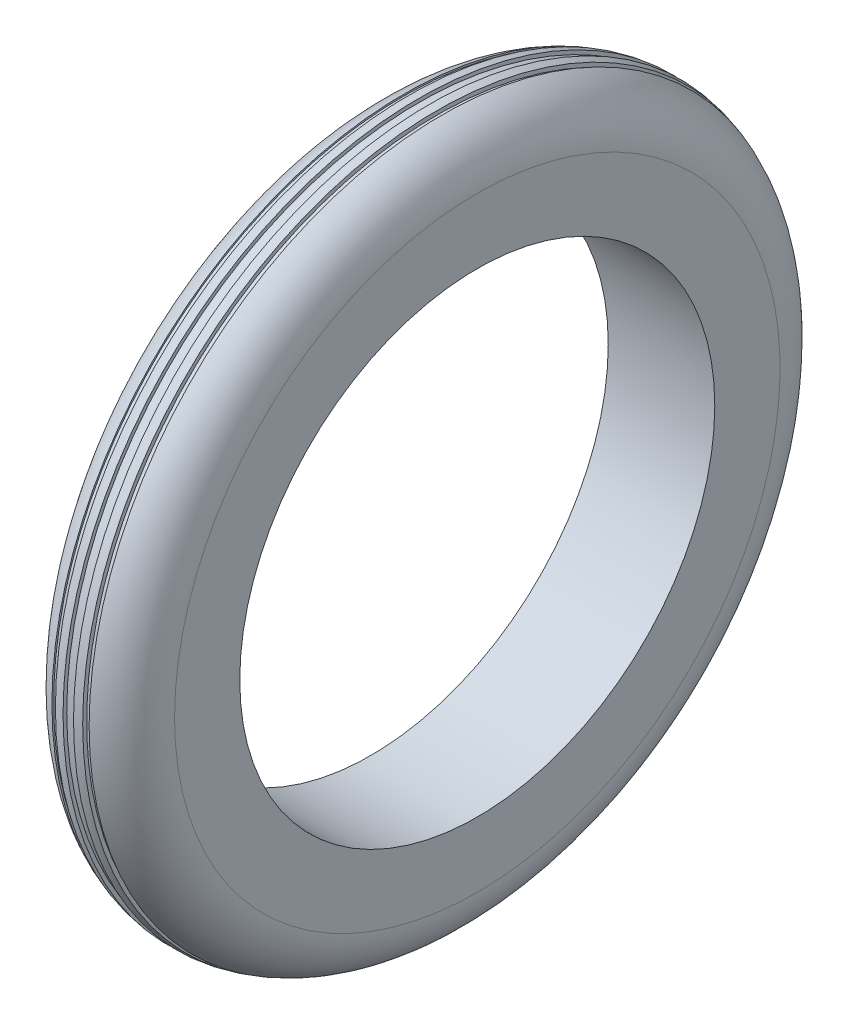
ISO-10303-21;
HEADER;
FILE_DESCRIPTION(('STEP AP214'),'2;1');
FILE_NAME('part.step','',(''),(''),'','','');
FILE_SCHEMA(('AUTOMOTIVE_DESIGN { 1 0 10303 214 1 1 1 1 }'));
ENDSEC;
DATA;
#1=APPLICATION_CONTEXT('core data for automotive mechanical design processes');
#2=APPLICATION_PROTOCOL_DEFINITION('international standard','automotive_design',2000,#1);
#3=PRODUCT_CONTEXT('',#1,'mechanical');
#4=PRODUCT('Part','Part','',(#3));
#5=PRODUCT_RELATED_PRODUCT_CATEGORY('part','',(#4));
#6=PRODUCT_DEFINITION_FORMATION('','',#4);
#7=PRODUCT_DEFINITION_CONTEXT('part definition',#1,'design');
#8=PRODUCT_DEFINITION('design','',#6,#7);
#9=PRODUCT_DEFINITION_SHAPE('','',#8);
#10=(LENGTH_UNIT() NAMED_UNIT(*) SI_UNIT(.MILLI.,.METRE.));
#11=(NAMED_UNIT(*) PLANE_ANGLE_UNIT() SI_UNIT($,.RADIAN.));
#12=(NAMED_UNIT(*) SI_UNIT($,.STERADIAN.) SOLID_ANGLE_UNIT());
#13=UNCERTAINTY_MEASURE_WITH_UNIT(LENGTH_MEASURE(1.E-05),#10,'distance_accuracy_value','');
#14=(GEOMETRIC_REPRESENTATION_CONTEXT(3) GLOBAL_UNCERTAINTY_ASSIGNED_CONTEXT((#13)) GLOBAL_UNIT_ASSIGNED_CONTEXT((#10,
#11,#12)) REPRESENTATION_CONTEXT('',''));
#15=CARTESIAN_POINT('',(0.,0.,0.));
#16=DIRECTION('',(0.,0.,1.));
#17=DIRECTION('',(1.,0.,0.));
#18=AXIS2_PLACEMENT_3D('',#15,#16,#17);
#19=CARTESIAN_POINT('',(0.,0.,0.));
#20=DIRECTION('',(-1.,0.,0.));
#21=DIRECTION('',(0.,0.,1.));
#22=AXIS2_PLACEMENT_3D('',#19,#20,#21);
#23=TOROIDAL_SURFACE('',#22,57.3569794050343,10.091533180778);
#24=CARTESIAN_POINT('',(3.40400652026257,0.,0.));
#25=DIRECTION('',(1.,0.,0.));
#26=DIRECTION('',(0.,0.,-1.));
#27=AXIS2_PLACEMENT_3D('',#24,#25,#26);
#28=CIRCLE('',#27,66.8570731702955);
#29=CARTESIAN_POINT('',(3.40400652026257,0.,-66.8570731702955));
#30=VERTEX_POINT('',#29);
#31=EDGE_CURVE('E62',#30,#30,#28,.T.);
#32=ORIENTED_EDGE('',*,*,#31,.T.);
#33=EDGE_LOOP('',(#32));
#34=FACE_BOUND('',#33,.T.);
#35=CARTESIAN_POINT('',(10.091533180778,0.,0.));
#36=DIRECTION('',(-1.,0.,0.));
#37=DIRECTION('',(0.,0.,1.));
#38=AXIS2_PLACEMENT_3D('',#35,#36,#37);
#39=CIRCLE('',#38,57.3569794050343);
#40=CARTESIAN_POINT('',(10.091533180778,0.,57.3569794050343));
#41=VERTEX_POINT('',#40);
#42=EDGE_CURVE('E69',#41,#41,#39,.T.);
#43=ORIENTED_EDGE('',*,*,#42,.T.);
#44=EDGE_LOOP('',(#43));
#45=FACE_BOUND('',#44,.T.);
#46=ADVANCED_FACE('F35',(#34,#45),#23,.T.);
#47=CARTESIAN_POINT('',(-3.79205614659731,0.,0.));
#48=DIRECTION('',(-1.,0.,0.));
#49=DIRECTION('',(0.,0.,1.));
#50=AXIS2_PLACEMENT_3D('',#47,#48,#49);
#51=CIRCLE('',#50,66.7089498989889);
#52=CARTESIAN_POINT('',(-3.79205614659731,0.,66.7089498989889));
#53=VERTEX_POINT('',#52);
#54=EDGE_CURVE('E64',#53,#53,#51,.T.);
#55=ORIENTED_EDGE('',*,*,#54,.T.);
#56=EDGE_LOOP('',(#55));
#57=FACE_BOUND('',#56,.T.);
#58=CARTESIAN_POINT('',(-10.091533180778,0.,0.));
#59=DIRECTION('',(-1.,0.,0.));
#60=DIRECTION('',(0.,0.,1.));
#61=AXIS2_PLACEMENT_3D('',#58,#59,#60);
#62=CIRCLE('',#61,57.3569794050343);
#63=CARTESIAN_POINT('',(-10.091533180778,0.,57.3569794050343));
#64=VERTEX_POINT('',#63);
#65=EDGE_CURVE('E48',#64,#64,#62,.T.);
#66=ORIENTED_EDGE('',*,*,#65,.F.);
#67=EDGE_LOOP('',(#66));
#68=FACE_BOUND('',#67,.T.);
#69=ADVANCED_FACE('F119',(#57,#68),#23,.T.);
#70=CARTESIAN_POINT('',(10.091533180778,57.3569794050343,0.));
#71=DIRECTION('',(-1.,0.,0.));
#72=DIRECTION('',(0.,0.,1.));
#73=AXIS2_PLACEMENT_3D('',#70,#71,#72);
#74=PLANE('',#73);
#75=ORIENTED_EDGE('',*,*,#42,.F.);
#76=EDGE_LOOP('',(#75));
#77=FACE_BOUND('',#76,.T.);
#78=CARTESIAN_POINT('',(10.091533180778,0.,0.));
#79=DIRECTION('',(-1.,0.,0.));
#80=DIRECTION('',(0.,0.,1.));
#81=AXIS2_PLACEMENT_3D('',#78,#79,#80);
#82=CIRCLE('',#81,45.);
#83=CARTESIAN_POINT('',(10.091533180778,0.,45.));
#84=VERTEX_POINT('',#83);
#85=EDGE_CURVE('E10',#84,#84,#82,.T.);
#86=ORIENTED_EDGE('',*,*,#85,.T.);
#87=EDGE_LOOP('',(#86));
#88=FACE_BOUND('',#87,.T.);
#89=ADVANCED_FACE('F37',(#77,#88),#74,.F.);
#90=CARTESIAN_POINT('',(-52.28566048094,0.,0.));
#91=DIRECTION('',(-1.,0.,0.));
#92=DIRECTION('',(0.,0.,1.));
#93=AXIS2_PLACEMENT_3D('',#90,#91,#92);
#94=CYLINDRICAL_SURFACE('',#93,45.);
#95=ORIENTED_EDGE('',*,*,#85,.F.);
#96=EDGE_LOOP('',(#95));
#97=FACE_BOUND('',#96,.T.);
#98=CARTESIAN_POINT('',(-10.091533180778,0.,0.));
#99=DIRECTION('',(-1.,0.,0.));
#100=DIRECTION('',(0.,0.,1.));
#101=AXIS2_PLACEMENT_3D('',#98,#99,#100);
#102=CIRCLE('',#101,45.);
#103=CARTESIAN_POINT('',(-10.091533180778,0.,45.));
#104=VERTEX_POINT('',#103);
#105=EDGE_CURVE('E43',#104,#104,#102,.T.);
#106=ORIENTED_EDGE('',*,*,#105,.T.);
#107=EDGE_LOOP('',(#106));
#108=FACE_BOUND('',#107,.T.);
#109=ADVANCED_FACE('F230',(#97,#108),#94,.F.);
#110=CARTESIAN_POINT('',(-10.091533180778,57.3569794050343,0.));
#111=DIRECTION('',(1.,0.,0.));
#112=DIRECTION('',(0.,0.,-1.));
#113=AXIS2_PLACEMENT_3D('',#110,#111,#112);
#114=PLANE('',#113);
#115=ORIENTED_EDGE('',*,*,#105,.F.);
#116=EDGE_LOOP('',(#115));
#117=FACE_BOUND('',#116,.T.);
#118=ORIENTED_EDGE('',*,*,#65,.T.);
#119=EDGE_LOOP('',(#118));
#120=FACE_BOUND('',#119,.T.);
#121=ADVANCED_FACE('F173',(#117,#120),#114,.F.);
#122=CARTESIAN_POINT('',(3.40400652026257,71.0572143164591,0.));
#123=DIRECTION('',(1.,0.,0.));
#124=DIRECTION('',(0.,0.,-1.));
#125=AXIS2_PLACEMENT_3D('',#122,#123,#124);
#126=PLANE('',#125);
#127=CARTESIAN_POINT('',(3.40400652026257,0.,0.));
#128=DIRECTION('',(1.,0.,0.));
#129=DIRECTION('',(0.,0.,-1.));
#130=AXIS2_PLACEMENT_3D('',#127,#128,#129);
#131=CIRCLE('',#130,66.3894979920094);
#132=CARTESIAN_POINT('',(3.40400652026257,0.,-66.3894979920094));
#133=VERTEX_POINT('',#132);
#134=EDGE_CURVE('E87',#133,#133,#131,.T.);
#135=ORIENTED_EDGE('',*,*,#134,.T.);
#136=EDGE_LOOP('',(#135));
#137=FACE_BOUND('',#136,.T.);
#138=ORIENTED_EDGE('',*,*,#31,.F.);
#139=EDGE_LOOP('',(#138));
#140=FACE_BOUND('',#139,.T.);
#141=ADVANCED_FACE('F96',(#137,#140),#126,.F.);
#142=CARTESIAN_POINT('',(2.47046325537265,71.0572143164591,0.));
#143=DIRECTION('',(-1.,0.,0.));
#144=DIRECTION('',(0.,0.,1.));
#145=AXIS2_PLACEMENT_3D('',#142,#143,#144);
#146=PLANE('',#145);
#147=CARTESIAN_POINT('',(2.47046325537265,0.,0.));
#148=DIRECTION('',(1.,0.,0.));
#149=DIRECTION('',(0.,0.,-1.));
#150=AXIS2_PLACEMENT_3D('',#147,#148,#149);
#151=CIRCLE('',#150,66.3894979920094);
#152=CARTESIAN_POINT('',(2.47046325537265,0.,-66.3894979920094));
#153=VERTEX_POINT('',#152);
#154=EDGE_CURVE('E83',#153,#153,#151,.T.);
#155=ORIENTED_EDGE('',*,*,#154,.F.);
#156=EDGE_LOOP('',(#155));
#157=FACE_BOUND('',#156,.T.);
#158=CARTESIAN_POINT('',(2.47046325537265,0.,0.));
#159=DIRECTION('',(-1.,0.,0.));
#160=DIRECTION('',(0.,0.,1.));
#161=AXIS2_PLACEMENT_3D('',#158,#159,#160);
#162=CIRCLE('',#161,67.1414494081871);
#163=CARTESIAN_POINT('',(2.47046325537265,0.,67.1414494081871));
#164=VERTEX_POINT('',#163);
#165=EDGE_CURVE('E59',#164,#164,#162,.T.);
#166=ORIENTED_EDGE('',*,*,#165,.F.);
#167=EDGE_LOOP('',(#166));
#168=FACE_BOUND('',#167,.T.);
#169=ADVANCED_FACE('F103',(#157,#168),#146,.F.);
#170=CARTESIAN_POINT('',(38.3675753563151,0.,0.));
#171=DIRECTION('',(1.,0.,0.));
#172=DIRECTION('',(0.,0.,-1.));
#173=AXIS2_PLACEMENT_3D('',#170,#171,#172);
#174=CYLINDRICAL_SURFACE('',#173,66.3894979920094);
#175=ORIENTED_EDGE('',*,*,#134,.F.);
#176=EDGE_LOOP('',(#175));
#177=FACE_BOUND('',#176,.T.);
#178=ORIENTED_EDGE('',*,*,#154,.T.);
#179=EDGE_LOOP('',(#178));
#180=FACE_BOUND('',#179,.T.);
#181=ADVANCED_FACE('F99',(#177,#180),#174,.T.);
#182=CARTESIAN_POINT('',(-2.78071760963323,71.0572143164591,0.));
#183=DIRECTION('',(1.,0.,0.));
#184=DIRECTION('',(0.,0.,-1.));
#185=AXIS2_PLACEMENT_3D('',#182,#183,#184);
#186=PLANE('',#185);
#187=CARTESIAN_POINT('',(-2.78071760963323,0.,0.));
#188=DIRECTION('',(1.,0.,0.));
#189=DIRECTION('',(0.,0.,-1.));
#190=AXIS2_PLACEMENT_3D('',#187,#188,#189);
#191=CIRCLE('',#190,66.3894979920094);
#192=CARTESIAN_POINT('',(-2.78071760963323,0.,-66.3894979920094));
#193=VERTEX_POINT('',#192);
#194=EDGE_CURVE('E88',#193,#193,#191,.T.);
#195=ORIENTED_EDGE('',*,*,#194,.T.);
#196=EDGE_LOOP('',(#195));
#197=FACE_BOUND('',#196,.T.);
#198=CARTESIAN_POINT('',(-2.78071760963323,0.,0.));
#199=DIRECTION('',(1.,0.,0.));
#200=DIRECTION('',(0.,0.,-1.));
#201=AXIS2_PLACEMENT_3D('',#198,#199,#200);
#202=CIRCLE('',#201,67.0578376925375);
#203=CARTESIAN_POINT('',(-2.78071760963323,0.,-67.0578376925375));
#204=VERTEX_POINT('',#203);
#205=EDGE_CURVE('E39',#204,#204,#202,.T.);
#206=ORIENTED_EDGE('',*,*,#205,.F.);
#207=EDGE_LOOP('',(#206));
#208=FACE_BOUND('',#207,.T.);
#209=ADVANCED_FACE('F102',(#197,#208),#186,.F.);
#210=CARTESIAN_POINT('',(-3.79205614659731,71.0572143164591,0.));
#211=DIRECTION('',(-1.,0.,0.));
#212=DIRECTION('',(0.,0.,1.));
#213=AXIS2_PLACEMENT_3D('',#210,#211,#212);
#214=PLANE('',#213);
#215=CARTESIAN_POINT('',(-3.79205614659731,0.,0.));
#216=DIRECTION('',(1.,0.,0.));
#217=DIRECTION('',(0.,0.,-1.));
#218=AXIS2_PLACEMENT_3D('',#215,#216,#217);
#219=CIRCLE('',#218,66.3894979920094);
#220=CARTESIAN_POINT('',(-3.79205614659731,0.,-66.3894979920094));
#221=VERTEX_POINT('',#220);
#222=EDGE_CURVE('E84',#221,#221,#219,.T.);
#223=ORIENTED_EDGE('',*,*,#222,.F.);
#224=EDGE_LOOP('',(#223));
#225=FACE_BOUND('',#224,.T.);
#226=ORIENTED_EDGE('',*,*,#54,.F.);
#227=EDGE_LOOP('',(#226));
#228=FACE_BOUND('',#227,.T.);
#229=ADVANCED_FACE('F192',(#225,#228),#214,.F.);
#230=CARTESIAN_POINT('',(38.3675753563151,0.,0.));
#231=DIRECTION('',(1.,0.,0.));
#232=DIRECTION('',(0.,0.,-1.));
#233=AXIS2_PLACEMENT_3D('',#230,#231,#232);
#234=CYLINDRICAL_SURFACE('',#233,66.3894979920094);
#235=ORIENTED_EDGE('',*,*,#194,.F.);
#236=EDGE_LOOP('',(#235));
#237=FACE_BOUND('',#236,.T.);
#238=ORIENTED_EDGE('',*,*,#222,.T.);
#239=EDGE_LOOP('',(#238));
#240=FACE_BOUND('',#239,.T.);
#241=ADVANCED_FACE('F116',(#237,#240),#234,.T.);
#242=ORIENTED_EDGE('',*,*,#165,.T.);
#243=EDGE_LOOP('',(#242));
#244=FACE_BOUND('',#243,.T.);
#245=CARTESIAN_POINT('',(0.991426351927525,0.,0.));
#246=DIRECTION('',(1.,0.,0.));
#247=DIRECTION('',(0.,0.,-1.));
#248=AXIS2_PLACEMENT_3D('',#245,#246,#247);
#249=CIRCLE('',#248,67.3996939647262);
#250=CARTESIAN_POINT('',(0.991426351927525,0.,-67.3996939647262));
#251=VERTEX_POINT('',#250);
#252=EDGE_CURVE('E52',#251,#251,#249,.T.);
#253=ORIENTED_EDGE('',*,*,#252,.T.);
#254=EDGE_LOOP('',(#253));
#255=FACE_BOUND('',#254,.T.);
#256=ADVANCED_FACE('F112',(#244,#255),#23,.T.);
#257=CARTESIAN_POINT('',(-0.991426351927525,66.700679080306,0.));
#258=DIRECTION('',(-1.,0.,0.));
#259=DIRECTION('',(0.,0.,1.));
#260=AXIS2_PLACEMENT_3D('',#257,#258,#259);
#261=PLANE('',#260);
#262=CARTESIAN_POINT('',(-0.991426351927525,0.,0.));
#263=DIRECTION('',(1.,0.,0.));
#264=DIRECTION('',(0.,0.,-1.));
#265=AXIS2_PLACEMENT_3D('',#262,#263,#264);
#266=CIRCLE('',#265,66.700679080306);
#267=CARTESIAN_POINT('',(-0.991426351927525,0.,-66.700679080306));
#268=VERTEX_POINT('',#267);
#269=EDGE_CURVE('E56',#268,#268,#266,.T.);
#270=ORIENTED_EDGE('',*,*,#269,.F.);
#271=EDGE_LOOP('',(#270));
#272=FACE_BOUND('',#271,.T.);
#273=CARTESIAN_POINT('',(-0.991426351927525,0.,0.));
#274=DIRECTION('',(-1.,0.,0.));
#275=DIRECTION('',(0.,0.,1.));
#276=AXIS2_PLACEMENT_3D('',#273,#274,#275);
#277=CIRCLE('',#276,67.3996939647262);
#278=CARTESIAN_POINT('',(-0.991426351927525,0.,67.3996939647262));
#279=VERTEX_POINT('',#278);
#280=EDGE_CURVE('E55',#279,#279,#277,.T.);
#281=ORIENTED_EDGE('',*,*,#280,.F.);
#282=EDGE_LOOP('',(#281));
#283=FACE_BOUND('',#282,.T.);
#284=ADVANCED_FACE('F115',(#272,#283),#261,.F.);
#285=CARTESIAN_POINT('',(0.991426351927525,66.700679080306,0.));
#286=DIRECTION('',(1.,0.,0.));
#287=DIRECTION('',(0.,0.,-1.));
#288=AXIS2_PLACEMENT_3D('',#285,#286,#287);
#289=PLANE('',#288);
#290=CARTESIAN_POINT('',(0.991426351927525,0.,0.));
#291=DIRECTION('',(1.,0.,0.));
#292=DIRECTION('',(0.,0.,-1.));
#293=AXIS2_PLACEMENT_3D('',#290,#291,#292);
#294=CIRCLE('',#293,66.700679080306);
#295=CARTESIAN_POINT('',(0.991426351927525,0.,-66.700679080306));
#296=VERTEX_POINT('',#295);
#297=EDGE_CURVE('E80',#296,#296,#294,.T.);
#298=ORIENTED_EDGE('',*,*,#297,.T.);
#299=EDGE_LOOP('',(#298));
#300=FACE_BOUND('',#299,.T.);
#301=ORIENTED_EDGE('',*,*,#252,.F.);
#302=EDGE_LOOP('',(#301));
#303=FACE_BOUND('',#302,.T.);
#304=ADVANCED_FACE('F122',(#300,#303),#289,.F.);
#305=CARTESIAN_POINT('',(38.3675753563151,0.,0.));
#306=DIRECTION('',(1.,0.,0.));
#307=DIRECTION('',(0.,0.,-1.));
#308=AXIS2_PLACEMENT_3D('',#305,#306,#307);
#309=CYLINDRICAL_SURFACE('',#308,66.700679080306);
#310=ORIENTED_EDGE('',*,*,#297,.F.);
#311=EDGE_LOOP('',(#310));
#312=FACE_BOUND('',#311,.T.);
#313=ORIENTED_EDGE('',*,*,#269,.T.);
#314=EDGE_LOOP('',(#313));
#315=FACE_BOUND('',#314,.T.);
#316=ADVANCED_FACE('F124',(#312,#315),#309,.T.);
#317=ORIENTED_EDGE('',*,*,#205,.T.);
#318=EDGE_LOOP('',(#317));
#319=FACE_BOUND('',#318,.T.);
#320=ORIENTED_EDGE('',*,*,#280,.T.);
#321=EDGE_LOOP('',(#320));
#322=FACE_BOUND('',#321,.T.);
#323=ADVANCED_FACE('F118',(#319,#322),#23,.T.);
#324=CLOSED_SHELL('',(#46,#69,#89,#109,#121,#141,#169,#181,#209,#229,#241,#256,#284,#304,#316,#323));
#325=MANIFOLD_SOLID_BREP('B2',#324);
#326=ADVANCED_BREP_SHAPE_REPRESENTATION('',(#18,#325),#14);
#327=SHAPE_DEFINITION_REPRESENTATION(#9,#326);
ENDSEC;
END-ISO-10303-21;
